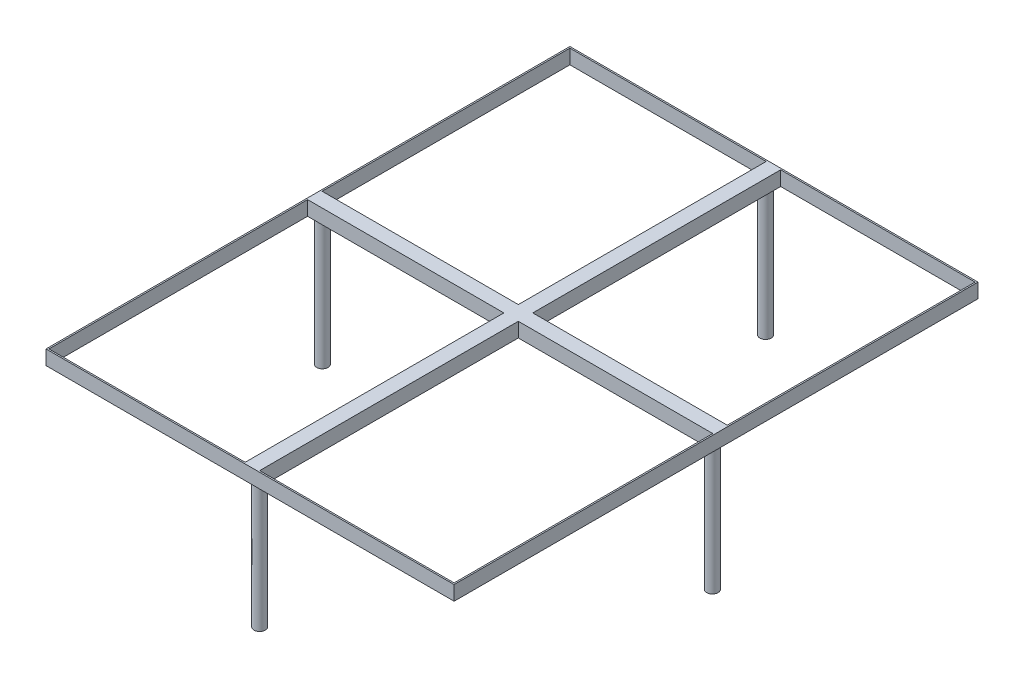
ISO-10303-21;
HEADER;
FILE_DESCRIPTION(('STEP AP214'),'2;1');
FILE_NAME('part.step','',(''),(''),'','','');
FILE_SCHEMA(('AUTOMOTIVE_DESIGN { 1 0 10303 214 1 1 1 1 }'));
ENDSEC;
DATA;
#1=APPLICATION_CONTEXT('core data for automotive mechanical design processes');
#2=APPLICATION_PROTOCOL_DEFINITION('international standard','automotive_design',2000,#1);
#3=PRODUCT_CONTEXT('',#1,'mechanical');
#4=PRODUCT('Part','Part','',(#3));
#5=PRODUCT_RELATED_PRODUCT_CATEGORY('part','',(#4));
#6=PRODUCT_DEFINITION_FORMATION('','',#4);
#7=PRODUCT_DEFINITION_CONTEXT('part definition',#1,'design');
#8=PRODUCT_DEFINITION('design','',#6,#7);
#9=PRODUCT_DEFINITION_SHAPE('','',#8);
#10=(LENGTH_UNIT() NAMED_UNIT(*) SI_UNIT(.MILLI.,.METRE.));
#11=(NAMED_UNIT(*) PLANE_ANGLE_UNIT() SI_UNIT($,.RADIAN.));
#12=(NAMED_UNIT(*) SI_UNIT($,.STERADIAN.) SOLID_ANGLE_UNIT());
#13=UNCERTAINTY_MEASURE_WITH_UNIT(LENGTH_MEASURE(1.E-05),#10,'distance_accuracy_value','');
#14=(GEOMETRIC_REPRESENTATION_CONTEXT(3) GLOBAL_UNCERTAINTY_ASSIGNED_CONTEXT((#13)) GLOBAL_UNIT_ASSIGNED_CONTEXT((#10,
#11,#12)) REPRESENTATION_CONTEXT('',''));
#15=CARTESIAN_POINT('',(0.,0.,0.));
#16=DIRECTION('',(0.,0.,1.));
#17=DIRECTION('',(1.,0.,0.));
#18=AXIS2_PLACEMENT_3D('',#15,#16,#17);
#19=CARTESIAN_POINT('',(-269.333333333334,20.,-269.333333333332));
#20=DIRECTION('',(1.,0.,0.));
#21=DIRECTION('',(0.,0.,-1.));
#22=AXIS2_PLACEMENT_3D('',#19,#20,#21);
#23=PLANE('',#22);
#24=DIRECTION('',(0.,0.,1.));
#25=VECTOR('',#24,1.);
#26=CARTESIAN_POINT('',(-269.333333333334,20.,-269.333333333332));
#27=LINE('',#26,#25);
#28=CARTESIAN_POINT('',(-269.333333333334,20.,-269.333333333332));
#29=VERTEX_POINT('',#28);
#30=CARTESIAN_POINT('',(-269.333333333334,20.,73.199168447962));
#31=VERTEX_POINT('',#30);
#32=EDGE_CURVE('E56',#29,#31,#27,.T.);
#33=ORIENTED_EDGE('',*,*,#32,.T.);
#34=DIRECTION('',(0.,1.,0.));
#35=VECTOR('',#34,1.);
#36=CARTESIAN_POINT('',(-269.333333333334,0.,73.1991684479621));
#37=LINE('',#36,#35);
#38=CARTESIAN_POINT('',(-269.333333333334,0.,73.199168447962));
#39=VERTEX_POINT('',#38);
#40=EDGE_CURVE('E254',#39,#31,#37,.T.);
#41=ORIENTED_EDGE('',*,*,#40,.F.);
#42=DIRECTION('',(0.,0.,1.));
#43=VECTOR('',#42,1.);
#44=CARTESIAN_POINT('',(-269.333333333334,0.,-269.333333333332));
#45=LINE('',#44,#43);
#46=CARTESIAN_POINT('',(-269.333333333334,0.,-269.333333333332));
#47=VERTEX_POINT('',#46);
#48=EDGE_CURVE('E283',#47,#39,#45,.T.);
#49=ORIENTED_EDGE('',*,*,#48,.F.);
#50=DIRECTION('',(0.,-1.,0.));
#51=VECTOR('',#50,1.);
#52=CARTESIAN_POINT('',(-269.333333333334,20.,-269.333333333332));
#53=LINE('',#52,#51);
#54=EDGE_CURVE('E282',#29,#47,#53,.T.);
#55=ORIENTED_EDGE('',*,*,#54,.F.);
#56=EDGE_LOOP('',(#33,#41,#49,#55));
#57=FACE_BOUND('',#56,.T.);
#58=ADVANCED_FACE('F41',(#57),#23,.T.);
#59=CARTESIAN_POINT('',(-269.333333333334,20.,450.666666666668));
#60=DIRECTION('',(0.,0.,-1.));
#61=DIRECTION('',(-1.,0.,0.));
#62=AXIS2_PLACEMENT_3D('',#59,#60,#61);
#63=PLANE('',#62);
#64=DIRECTION('',(1.,0.,0.));
#65=VECTOR('',#64,1.);
#66=CARTESIAN_POINT('',(-269.333333333334,0.,450.666666666668));
#67=LINE('',#66,#65);
#68=CARTESIAN_POINT('',(21.9402136821437,0.,450.666666666668));
#69=VERTEX_POINT('',#68);
#70=CARTESIAN_POINT('',(290.666666666666,0.,450.666666666668));
#71=VERTEX_POINT('',#70);
#72=EDGE_CURVE('E286',#69,#71,#67,.T.);
#73=ORIENTED_EDGE('',*,*,#72,.F.);
#74=DIRECTION('',(0.,1.,0.));
#75=VECTOR('',#74,1.);
#76=CARTESIAN_POINT('',(21.9402136821438,0.,450.666666666668));
#77=LINE('',#76,#75);
#78=CARTESIAN_POINT('',(21.9402136821438,20.,450.666666666668));
#79=VERTEX_POINT('',#78);
#80=EDGE_CURVE('E199',#69,#79,#77,.T.);
#81=ORIENTED_EDGE('',*,*,#80,.T.);
#82=DIRECTION('',(1.,0.,0.));
#83=VECTOR('',#82,1.);
#84=CARTESIAN_POINT('',(-269.333333333334,20.,450.666666666668));
#85=LINE('',#84,#83);
#86=CARTESIAN_POINT('',(290.666666666666,20.,450.666666666668));
#87=VERTEX_POINT('',#86);
#88=EDGE_CURVE('E272',#79,#87,#85,.T.);
#89=ORIENTED_EDGE('',*,*,#88,.T.);
#90=DIRECTION('',(0.,-1.,0.));
#91=VECTOR('',#90,1.);
#92=CARTESIAN_POINT('',(290.666666666666,20.,450.666666666668));
#93=LINE('',#92,#91);
#94=EDGE_CURVE('E301',#87,#71,#93,.T.);
#95=ORIENTED_EDGE('',*,*,#94,.T.);
#96=EDGE_LOOP('',(#73,#81,#89,#95));
#97=FACE_BOUND('',#96,.T.);
#98=ADVANCED_FACE('F406',(#97),#63,.T.);
#99=CARTESIAN_POINT('',(290.666666666666,20.,-269.333333333332));
#100=DIRECTION('',(-1.,0.,0.));
#101=DIRECTION('',(0.,0.,1.));
#102=AXIS2_PLACEMENT_3D('',#99,#100,#101);
#103=PLANE('',#102);
#104=DIRECTION('',(0.,0.,-1.));
#105=VECTOR('',#104,1.);
#106=CARTESIAN_POINT('',(290.666666666666,0.,-269.333333333332));
#107=LINE('',#106,#105);
#108=CARTESIAN_POINT('',(290.666666666666,0.,73.199168447962));
#109=VERTEX_POINT('',#108);
#110=CARTESIAN_POINT('',(290.666666666666,0.,-269.333333333332));
#111=VERTEX_POINT('',#110);
#112=EDGE_CURVE('E290',#109,#111,#107,.T.);
#113=ORIENTED_EDGE('',*,*,#112,.F.);
#114=DIRECTION('',(0.,1.,0.));
#115=VECTOR('',#114,1.);
#116=CARTESIAN_POINT('',(290.666666666666,0.,73.1991684479621));
#117=LINE('',#116,#115);
#118=CARTESIAN_POINT('',(290.666666666666,20.,73.1991684479621));
#119=VERTEX_POINT('',#118);
#120=EDGE_CURVE('E267',#109,#119,#117,.T.);
#121=ORIENTED_EDGE('',*,*,#120,.T.);
#122=DIRECTION('',(0.,0.,-1.));
#123=VECTOR('',#122,1.);
#124=CARTESIAN_POINT('',(290.666666666666,20.,-269.333333333332));
#125=LINE('',#124,#123);
#126=CARTESIAN_POINT('',(290.666666666666,20.,-269.333333333332));
#127=VERTEX_POINT('',#126);
#128=EDGE_CURVE('E276',#119,#127,#125,.T.);
#129=ORIENTED_EDGE('',*,*,#128,.T.);
#130=DIRECTION('',(0.,-1.,0.));
#131=VECTOR('',#130,1.);
#132=CARTESIAN_POINT('',(290.666666666666,20.,-269.333333333332));
#133=LINE('',#132,#131);
#134=EDGE_CURVE('E298',#127,#111,#133,.T.);
#135=ORIENTED_EDGE('',*,*,#134,.T.);
#136=EDGE_LOOP('',(#113,#121,#129,#135));
#137=FACE_BOUND('',#136,.T.);
#138=ADVANCED_FACE('F389',(#137),#103,.T.);
#139=CARTESIAN_POINT('',(-269.333333333334,20.,-269.333333333332));
#140=DIRECTION('',(0.,0.,1.));
#141=DIRECTION('',(1.,0.,0.));
#142=AXIS2_PLACEMENT_3D('',#139,#140,#141);
#143=PLANE('',#142);
#144=DIRECTION('',(-1.,0.,0.));
#145=VECTOR('',#144,1.);
#146=CARTESIAN_POINT('',(-269.333333333334,20.,-269.333333333332));
#147=LINE('',#146,#145);
#148=CARTESIAN_POINT('',(21.9402136821437,20.,-269.333333333332));
#149=VERTEX_POINT('',#148);
#150=EDGE_CURVE('E280',#127,#149,#147,.T.);
#151=ORIENTED_EDGE('',*,*,#150,.T.);
#152=DIRECTION('',(0.,1.,0.));
#153=VECTOR('',#152,1.);
#154=CARTESIAN_POINT('',(21.9402136821437,0.,-269.333333333332));
#155=LINE('',#154,#153);
#156=CARTESIAN_POINT('',(21.9402136821437,0.,-269.333333333332));
#157=VERTEX_POINT('',#156);
#158=EDGE_CURVE('E261',#157,#149,#155,.T.);
#159=ORIENTED_EDGE('',*,*,#158,.F.);
#160=DIRECTION('',(-1.,0.,0.));
#161=VECTOR('',#160,1.);
#162=CARTESIAN_POINT('',(-269.333333333334,0.,-269.333333333332));
#163=LINE('',#162,#161);
#164=EDGE_CURVE('E293',#111,#157,#163,.T.);
#165=ORIENTED_EDGE('',*,*,#164,.F.);
#166=ORIENTED_EDGE('',*,*,#134,.F.);
#167=EDGE_LOOP('',(#151,#159,#165,#166));
#168=FACE_BOUND('',#167,.T.);
#169=ADVANCED_FACE('F375',(#168),#143,.T.);
#170=CARTESIAN_POINT('',(0.,20.,0.));
#171=DIRECTION('',(0.,1.,0.));
#172=DIRECTION('',(0.,0.,1.));
#173=AXIS2_PLACEMENT_3D('',#170,#171,#172);
#174=PLANE('',#173);
#175=DIRECTION('',(1.,0.,0.));
#176=VECTOR('',#175,1.);
#177=CARTESIAN_POINT('',(0.,20.,73.1991684479621));
#178=LINE('',#177,#176);
#179=CARTESIAN_POINT('',(1.94021368214367,20.,73.1991684479621));
#180=VERTEX_POINT('',#179);
#181=EDGE_CURVE('E238',#31,#180,#178,.T.);
#182=ORIENTED_EDGE('',*,*,#181,.F.);
#183=ORIENTED_EDGE('',*,*,#32,.F.);
#184=CARTESIAN_POINT('',(1.94021368214364,20.,-269.333333333332));
#185=VERTEX_POINT('',#184);
#186=EDGE_CURVE('E279',#185,#29,#147,.T.);
#187=ORIENTED_EDGE('',*,*,#186,.F.);
#188=DIRECTION('',(0.,0.,1.));
#189=VECTOR('',#188,1.);
#190=CARTESIAN_POINT('',(1.94021368214369,20.,0.));
#191=LINE('',#190,#189);
#192=EDGE_CURVE('E235',#185,#180,#191,.T.);
#193=ORIENTED_EDGE('',*,*,#192,.T.);
#194=EDGE_LOOP('',(#182,#183,#187,#193));
#195=FACE_BOUND('',#194,.T.);
#196=DIRECTION('',(0.,0.,1.));
#197=VECTOR('',#196,1.);
#198=CARTESIAN_POINT('',(1.94021368214369,20.,0.));
#199=LINE('',#198,#197);
#200=CARTESIAN_POINT('',(1.94021368214373,20.,93.1991684479621));
#201=VERTEX_POINT('',#200);
#202=CARTESIAN_POINT('',(1.94021368214375,20.,450.666666666668));
#203=VERTEX_POINT('',#202);
#204=EDGE_CURVE('E201',#201,#203,#199,.T.);
#205=ORIENTED_EDGE('',*,*,#204,.T.);
#206=CARTESIAN_POINT('',(-269.333333333334,20.,450.666666666668));
#207=VERTEX_POINT('',#206);
#208=EDGE_CURVE('E274',#207,#203,#85,.T.);
#209=ORIENTED_EDGE('',*,*,#208,.F.);
#210=CARTESIAN_POINT('',(-269.333333333334,20.,93.1991684479621));
#211=VERTEX_POINT('',#210);
#212=EDGE_CURVE('E273',#211,#207,#27,.T.);
#213=ORIENTED_EDGE('',*,*,#212,.F.);
#214=DIRECTION('',(1.,0.,0.));
#215=VECTOR('',#214,1.);
#216=CARTESIAN_POINT('',(0.,20.,93.1991684479621));
#217=LINE('',#216,#215);
#218=EDGE_CURVE('E241',#211,#201,#217,.T.);
#219=ORIENTED_EDGE('',*,*,#218,.T.);
#220=EDGE_LOOP('',(#205,#209,#213,#219));
#221=FACE_BOUND('',#220,.T.);
#222=DIRECTION('',(1.,0.,0.));
#223=VECTOR('',#222,1.);
#224=CARTESIAN_POINT('',(0.,20.,93.1991684479621));
#225=LINE('',#224,#223);
#226=CARTESIAN_POINT('',(21.9402136821437,20.,93.1991684479621));
#227=VERTEX_POINT('',#226);
#228=CARTESIAN_POINT('',(290.666666666666,20.,93.199168447962));
#229=VERTEX_POINT('',#228);
#230=EDGE_CURVE('E187',#227,#229,#225,.T.);
#231=ORIENTED_EDGE('',*,*,#230,.T.);
#232=EDGE_CURVE('E277',#87,#229,#125,.T.);
#233=ORIENTED_EDGE('',*,*,#232,.F.);
#234=ORIENTED_EDGE('',*,*,#88,.F.);
#235=DIRECTION('',(0.,0.,1.));
#236=VECTOR('',#235,1.);
#237=CARTESIAN_POINT('',(21.9402136821437,20.,0.));
#238=LINE('',#237,#236);
#239=EDGE_CURVE('E226',#227,#79,#238,.T.);
#240=ORIENTED_EDGE('',*,*,#239,.F.);
#241=EDGE_LOOP('',(#231,#233,#234,#240));
#242=FACE_BOUND('',#241,.T.);
#243=DIRECTION('',(0.,0.,1.));
#244=VECTOR('',#243,1.);
#245=CARTESIAN_POINT('',(-271.333333333334,20.,-271.333333333332));
#246=LINE('',#245,#244);
#247=CARTESIAN_POINT('',(-271.333333333334,20.,-271.333333333332));
#248=VERTEX_POINT('',#247);
#249=CARTESIAN_POINT('',(-271.333333333334,20.,452.666666666668));
#250=VERTEX_POINT('',#249);
#251=EDGE_CURVE('E307',#248,#250,#246,.T.);
#252=ORIENTED_EDGE('',*,*,#251,.T.);
#253=DIRECTION('',(1.,0.,0.));
#254=VECTOR('',#253,1.);
#255=CARTESIAN_POINT('',(-271.333333333334,20.,452.666666666668));
#256=LINE('',#255,#254);
#257=CARTESIAN_POINT('',(292.666666666666,20.,452.666666666668));
#258=VERTEX_POINT('',#257);
#259=EDGE_CURVE('E310',#250,#258,#256,.T.);
#260=ORIENTED_EDGE('',*,*,#259,.T.);
#261=DIRECTION('',(0.,0.,-1.));
#262=VECTOR('',#261,1.);
#263=CARTESIAN_POINT('',(292.666666666666,20.,-271.333333333332));
#264=LINE('',#263,#262);
#265=CARTESIAN_POINT('',(292.666666666666,20.,-271.333333333332));
#266=VERTEX_POINT('',#265);
#267=EDGE_CURVE('E313',#258,#266,#264,.T.);
#268=ORIENTED_EDGE('',*,*,#267,.T.);
#269=DIRECTION('',(-1.,0.,0.));
#270=VECTOR('',#269,1.);
#271=CARTESIAN_POINT('',(-271.333333333334,20.,-271.333333333332));
#272=LINE('',#271,#270);
#273=EDGE_CURVE('E315',#266,#248,#272,.T.);
#274=ORIENTED_EDGE('',*,*,#273,.T.);
#275=EDGE_LOOP('',(#252,#260,#268,#274));
#276=FACE_BOUND('',#275,.T.);
#277=ORIENTED_EDGE('',*,*,#128,.F.);
#278=DIRECTION('',(1.,0.,0.));
#279=VECTOR('',#278,1.);
#280=CARTESIAN_POINT('',(0.,20.,73.1991684479621));
#281=LINE('',#280,#279);
#282=CARTESIAN_POINT('',(21.9402136821437,20.,73.1991684479621));
#283=VERTEX_POINT('',#282);
#284=EDGE_CURVE('E230',#283,#119,#281,.T.);
#285=ORIENTED_EDGE('',*,*,#284,.F.);
#286=DIRECTION('',(0.,0.,1.));
#287=VECTOR('',#286,1.);
#288=CARTESIAN_POINT('',(21.9402136821437,20.,0.));
#289=LINE('',#288,#287);
#290=EDGE_CURVE('E233',#149,#283,#289,.T.);
#291=ORIENTED_EDGE('',*,*,#290,.F.);
#292=ORIENTED_EDGE('',*,*,#150,.F.);
#293=EDGE_LOOP('',(#277,#285,#291,#292));
#294=FACE_BOUND('',#293,.T.);
#295=ADVANCED_FACE('F348',(#195,#221,#242,#276,#294),#174,.T.);
#296=CARTESIAN_POINT('',(0.,0.,0.));
#297=DIRECTION('',(0.,1.,0.));
#298=DIRECTION('',(0.,0.,1.));
#299=AXIS2_PLACEMENT_3D('',#296,#297,#298);
#300=PLANE('',#299);
#301=CARTESIAN_POINT('',(-258.982651015203,0.,83.0174274599046));
#302=DIRECTION('',(0.,1.,0.));
#303=DIRECTION('',(0.,0.,1.));
#304=AXIS2_PLACEMENT_3D('',#301,#302,#303);
#305=CIRCLE('',#304,7.80799506400789);
#306=CARTESIAN_POINT('',(-258.982651015203,0.,90.8254225239125));
#307=VERTEX_POINT('',#306);
#308=EDGE_CURVE('E11',#307,#307,#305,.F.);
#309=ORIENTED_EDGE('',*,*,#308,.F.);
#310=EDGE_LOOP('',(#309));
#311=FACE_BOUND('',#310,.T.);
#312=CARTESIAN_POINT('',(12.045659380478,0.,-258.363567648438));
#313=DIRECTION('',(0.,1.,0.));
#314=DIRECTION('',(0.,0.,1.));
#315=AXIS2_PLACEMENT_3D('',#312,#313,#314);
#316=CIRCLE('',#315,7.8079950640079);
#317=CARTESIAN_POINT('',(12.045659380478,0.,-250.55557258443));
#318=VERTEX_POINT('',#317);
#319=EDGE_CURVE('E49',#318,#318,#316,.F.);
#320=ORIENTED_EDGE('',*,*,#319,.F.);
#321=EDGE_LOOP('',(#320));
#322=FACE_BOUND('',#321,.T.);
#323=CARTESIAN_POINT('',(12.045659380478,0.,440.740646454213));
#324=DIRECTION('',(0.,1.,0.));
#325=DIRECTION('',(0.,0.,1.));
#326=AXIS2_PLACEMENT_3D('',#323,#324,#325);
#327=CIRCLE('',#326,7.8079950640079);
#328=CARTESIAN_POINT('',(12.045659380478,0.,448.548641518221));
#329=VERTEX_POINT('',#328);
#330=EDGE_CURVE('E339',#329,#329,#327,.F.);
#331=ORIENTED_EDGE('',*,*,#330,.F.);
#332=EDGE_LOOP('',(#331));
#333=FACE_BOUND('',#332,.T.);
#334=CARTESIAN_POINT('',(279.956227740303,0.,83.0174274599046));
#335=DIRECTION('',(0.,1.,0.));
#336=DIRECTION('',(0.,0.,1.));
#337=AXIS2_PLACEMENT_3D('',#334,#335,#336);
#338=CIRCLE('',#337,7.80799506400789);
#339=CARTESIAN_POINT('',(279.956227740303,0.,90.8254225239125));
#340=VERTEX_POINT('',#339);
#341=EDGE_CURVE('E336',#340,#340,#338,.F.);
#342=ORIENTED_EDGE('',*,*,#341,.F.);
#343=EDGE_LOOP('',(#342));
#344=FACE_BOUND('',#343,.T.);
#345=ORIENTED_EDGE('',*,*,#48,.T.);
#346=DIRECTION('',(1.,0.,0.));
#347=VECTOR('',#346,1.);
#348=CARTESIAN_POINT('',(0.,0.,73.1991684479621));
#349=LINE('',#348,#347);
#350=CARTESIAN_POINT('',(1.94021368214367,0.,73.1991684479621));
#351=VERTEX_POINT('',#350);
#352=EDGE_CURVE('E219',#39,#351,#349,.T.);
#353=ORIENTED_EDGE('',*,*,#352,.T.);
#354=DIRECTION('',(0.,0.,1.));
#355=VECTOR('',#354,1.);
#356=CARTESIAN_POINT('',(1.94021368214369,0.,0.));
#357=LINE('',#356,#355);
#358=CARTESIAN_POINT('',(1.94021368214364,0.,-269.333333333332));
#359=VERTEX_POINT('',#358);
#360=EDGE_CURVE('E216',#359,#351,#357,.T.);
#361=ORIENTED_EDGE('',*,*,#360,.F.);
#362=EDGE_CURVE('E292',#359,#47,#163,.T.);
#363=ORIENTED_EDGE('',*,*,#362,.T.);
#364=EDGE_LOOP('',(#345,#353,#361,#363));
#365=FACE_BOUND('',#364,.T.);
#366=CARTESIAN_POINT('',(-269.333333333334,0.,450.666666666668));
#367=VERTEX_POINT('',#366);
#368=CARTESIAN_POINT('',(1.94021368214375,0.,450.666666666668));
#369=VERTEX_POINT('',#368);
#370=EDGE_CURVE('E287',#367,#369,#67,.T.);
#371=ORIENTED_EDGE('',*,*,#370,.T.);
#372=DIRECTION('',(0.,0.,1.));
#373=VECTOR('',#372,1.);
#374=CARTESIAN_POINT('',(1.94021368214369,0.,0.));
#375=LINE('',#374,#373);
#376=CARTESIAN_POINT('',(1.94021368214373,0.,93.1991684479621));
#377=VERTEX_POINT('',#376);
#378=EDGE_CURVE('E192',#377,#369,#375,.T.);
#379=ORIENTED_EDGE('',*,*,#378,.F.);
#380=DIRECTION('',(1.,0.,0.));
#381=VECTOR('',#380,1.);
#382=CARTESIAN_POINT('',(0.,0.,93.1991684479621));
#383=LINE('',#382,#381);
#384=CARTESIAN_POINT('',(-269.333333333334,0.,93.199168447962));
#385=VERTEX_POINT('',#384);
#386=EDGE_CURVE('E221',#385,#377,#383,.T.);
#387=ORIENTED_EDGE('',*,*,#386,.F.);
#388=EDGE_CURVE('E64',#385,#367,#45,.T.);
#389=ORIENTED_EDGE('',*,*,#388,.T.);
#390=EDGE_LOOP('',(#371,#379,#387,#389));
#391=FACE_BOUND('',#390,.T.);
#392=CARTESIAN_POINT('',(290.666666666666,0.,93.199168447962));
#393=VERTEX_POINT('',#392);
#394=EDGE_CURVE('E207',#71,#393,#107,.T.);
#395=ORIENTED_EDGE('',*,*,#394,.T.);
#396=DIRECTION('',(1.,0.,0.));
#397=VECTOR('',#396,1.);
#398=CARTESIAN_POINT('',(0.,0.,93.1991684479621));
#399=LINE('',#398,#397);
#400=CARTESIAN_POINT('',(21.9402136821437,0.,93.1991684479621));
#401=VERTEX_POINT('',#400);
#402=EDGE_CURVE('E185',#401,#393,#399,.T.);
#403=ORIENTED_EDGE('',*,*,#402,.F.);
#404=DIRECTION('',(0.,0.,1.));
#405=VECTOR('',#404,1.);
#406=CARTESIAN_POINT('',(21.9402136821437,0.,0.));
#407=LINE('',#406,#405);
#408=EDGE_CURVE('E196',#401,#69,#407,.T.);
#409=ORIENTED_EDGE('',*,*,#408,.T.);
#410=ORIENTED_EDGE('',*,*,#72,.T.);
#411=EDGE_LOOP('',(#395,#403,#409,#410));
#412=FACE_BOUND('',#411,.T.);
#413=DIRECTION('',(0.,0.,1.));
#414=VECTOR('',#413,1.);
#415=CARTESIAN_POINT('',(-271.333333333334,0.,-271.333333333332));
#416=LINE('',#415,#414);
#417=CARTESIAN_POINT('',(-271.333333333334,0.,-271.333333333332));
#418=VERTEX_POINT('',#417);
#419=CARTESIAN_POINT('',(-271.333333333334,0.,452.666666666668));
#420=VERTEX_POINT('',#419);
#421=EDGE_CURVE('E306',#418,#420,#416,.T.);
#422=ORIENTED_EDGE('',*,*,#421,.F.);
#423=DIRECTION('',(-1.,0.,0.));
#424=VECTOR('',#423,1.);
#425=CARTESIAN_POINT('',(-271.333333333334,0.,-271.333333333332));
#426=LINE('',#425,#424);
#427=CARTESIAN_POINT('',(292.666666666666,0.,-271.333333333332));
#428=VERTEX_POINT('',#427);
#429=EDGE_CURVE('E311',#428,#418,#426,.T.);
#430=ORIENTED_EDGE('',*,*,#429,.F.);
#431=DIRECTION('',(0.,0.,-1.));
#432=VECTOR('',#431,1.);
#433=CARTESIAN_POINT('',(292.666666666666,0.,-271.333333333332));
#434=LINE('',#433,#432);
#435=CARTESIAN_POINT('',(292.666666666666,0.,452.666666666668));
#436=VERTEX_POINT('',#435);
#437=EDGE_CURVE('E322',#436,#428,#434,.T.);
#438=ORIENTED_EDGE('',*,*,#437,.F.);
#439=DIRECTION('',(1.,0.,0.));
#440=VECTOR('',#439,1.);
#441=CARTESIAN_POINT('',(-271.333333333334,0.,452.666666666668));
#442=LINE('',#441,#440);
#443=EDGE_CURVE('E320',#420,#436,#442,.T.);
#444=ORIENTED_EDGE('',*,*,#443,.F.);
#445=EDGE_LOOP('',(#422,#430,#438,#444));
#446=FACE_BOUND('',#445,.T.);
#447=DIRECTION('',(1.,0.,0.));
#448=VECTOR('',#447,1.);
#449=CARTESIAN_POINT('',(0.,0.,73.1991684479621));
#450=LINE('',#449,#448);
#451=CARTESIAN_POINT('',(21.9402136821437,0.,73.1991684479621));
#452=VERTEX_POINT('',#451);
#453=EDGE_CURVE('E208',#452,#109,#450,.T.);
#454=ORIENTED_EDGE('',*,*,#453,.T.);
#455=ORIENTED_EDGE('',*,*,#112,.T.);
#456=ORIENTED_EDGE('',*,*,#164,.T.);
#457=DIRECTION('',(0.,0.,1.));
#458=VECTOR('',#457,1.);
#459=CARTESIAN_POINT('',(21.9402136821437,0.,0.));
#460=LINE('',#459,#458);
#461=EDGE_CURVE('E211',#157,#452,#460,.T.);
#462=ORIENTED_EDGE('',*,*,#461,.T.);
#463=EDGE_LOOP('',(#454,#455,#456,#462));
#464=FACE_BOUND('',#463,.T.);
#465=ADVANCED_FACE('F204',(#311,#322,#333,#344,#365,#391,#412,#446,#464),#300,.F.);
#466=CARTESIAN_POINT('',(-271.333333333334,20.,-271.333333333332));
#467=DIRECTION('',(1.,0.,0.));
#468=DIRECTION('',(0.,0.,-1.));
#469=AXIS2_PLACEMENT_3D('',#466,#467,#468);
#470=PLANE('',#469);
#471=ORIENTED_EDGE('',*,*,#421,.T.);
#472=DIRECTION('',(0.,-1.,0.));
#473=VECTOR('',#472,1.);
#474=CARTESIAN_POINT('',(-271.333333333334,20.,452.666666666668));
#475=LINE('',#474,#473);
#476=EDGE_CURVE('E333',#250,#420,#475,.T.);
#477=ORIENTED_EDGE('',*,*,#476,.F.);
#478=ORIENTED_EDGE('',*,*,#251,.F.);
#479=DIRECTION('',(0.,-1.,0.));
#480=VECTOR('',#479,1.);
#481=CARTESIAN_POINT('',(-271.333333333334,20.,-271.333333333332));
#482=LINE('',#481,#480);
#483=EDGE_CURVE('E317',#248,#418,#482,.T.);
#484=ORIENTED_EDGE('',*,*,#483,.T.);
#485=EDGE_LOOP('',(#471,#477,#478,#484));
#486=FACE_BOUND('',#485,.T.);
#487=ADVANCED_FACE('F43',(#486),#470,.F.);
#488=CARTESIAN_POINT('',(-271.333333333334,20.,452.666666666668));
#489=DIRECTION('',(0.,0.,-1.));
#490=DIRECTION('',(-1.,0.,0.));
#491=AXIS2_PLACEMENT_3D('',#488,#489,#490);
#492=PLANE('',#491);
#493=ORIENTED_EDGE('',*,*,#443,.T.);
#494=DIRECTION('',(0.,-1.,0.));
#495=VECTOR('',#494,1.);
#496=CARTESIAN_POINT('',(292.666666666666,20.,452.666666666668));
#497=LINE('',#496,#495);
#498=EDGE_CURVE('E330',#258,#436,#497,.T.);
#499=ORIENTED_EDGE('',*,*,#498,.F.);
#500=ORIENTED_EDGE('',*,*,#259,.F.);
#501=ORIENTED_EDGE('',*,*,#476,.T.);
#502=EDGE_LOOP('',(#493,#499,#500,#501));
#503=FACE_BOUND('',#502,.T.);
#504=ADVANCED_FACE('F431',(#503),#492,.F.);
#505=CARTESIAN_POINT('',(292.666666666666,20.,-271.333333333332));
#506=DIRECTION('',(-1.,0.,0.));
#507=DIRECTION('',(0.,0.,1.));
#508=AXIS2_PLACEMENT_3D('',#505,#506,#507);
#509=PLANE('',#508);
#510=ORIENTED_EDGE('',*,*,#437,.T.);
#511=DIRECTION('',(0.,-1.,0.));
#512=VECTOR('',#511,1.);
#513=CARTESIAN_POINT('',(292.666666666666,20.,-271.333333333332));
#514=LINE('',#513,#512);
#515=EDGE_CURVE('E327',#266,#428,#514,.T.);
#516=ORIENTED_EDGE('',*,*,#515,.F.);
#517=ORIENTED_EDGE('',*,*,#267,.F.);
#518=ORIENTED_EDGE('',*,*,#498,.T.);
#519=EDGE_LOOP('',(#510,#516,#517,#518));
#520=FACE_BOUND('',#519,.T.);
#521=ADVANCED_FACE('F425',(#520),#509,.F.);
#522=CARTESIAN_POINT('',(-271.333333333334,20.,-271.333333333332));
#523=DIRECTION('',(0.,0.,1.));
#524=DIRECTION('',(1.,0.,0.));
#525=AXIS2_PLACEMENT_3D('',#522,#523,#524);
#526=PLANE('',#525);
#527=ORIENTED_EDGE('',*,*,#429,.T.);
#528=ORIENTED_EDGE('',*,*,#483,.F.);
#529=ORIENTED_EDGE('',*,*,#273,.F.);
#530=ORIENTED_EDGE('',*,*,#515,.T.);
#531=EDGE_LOOP('',(#527,#528,#529,#530));
#532=FACE_BOUND('',#531,.T.);
#533=ADVANCED_FACE('F421',(#532),#526,.F.);
#534=DIRECTION('',(0.,1.,0.));
#535=VECTOR('',#534,1.);
#536=CARTESIAN_POINT('',(-269.333333333334,0.,93.1991684479621));
#537=LINE('',#536,#535);
#538=EDGE_CURVE('E252',#385,#211,#537,.T.);
#539=ORIENTED_EDGE('',*,*,#538,.T.);
#540=ORIENTED_EDGE('',*,*,#212,.T.);
#541=DIRECTION('',(0.,-1.,0.));
#542=VECTOR('',#541,1.);
#543=CARTESIAN_POINT('',(-269.333333333334,20.,450.666666666668));
#544=LINE('',#543,#542);
#545=EDGE_CURVE('E304',#207,#367,#544,.T.);
#546=ORIENTED_EDGE('',*,*,#545,.T.);
#547=ORIENTED_EDGE('',*,*,#388,.F.);
#548=EDGE_LOOP('',(#539,#540,#546,#547));
#549=FACE_BOUND('',#548,.T.);
#550=ADVANCED_FACE('F369',(#549),#23,.T.);
#551=DIRECTION('',(0.,1.,0.));
#552=VECTOR('',#551,1.);
#553=CARTESIAN_POINT('',(1.94021368214373,0.,450.666666666668));
#554=LINE('',#553,#552);
#555=EDGE_CURVE('E247',#369,#203,#554,.T.);
#556=ORIENTED_EDGE('',*,*,#555,.F.);
#557=ORIENTED_EDGE('',*,*,#370,.F.);
#558=ORIENTED_EDGE('',*,*,#545,.F.);
#559=ORIENTED_EDGE('',*,*,#208,.T.);
#560=EDGE_LOOP('',(#556,#557,#558,#559));
#561=FACE_BOUND('',#560,.T.);
#562=ADVANCED_FACE('F372',(#561),#63,.T.);
#563=DIRECTION('',(0.,1.,0.));
#564=VECTOR('',#563,1.);
#565=CARTESIAN_POINT('',(290.666666666666,0.,93.1991684479621));
#566=LINE('',#565,#564);
#567=EDGE_CURVE('E191',#393,#229,#566,.T.);
#568=ORIENTED_EDGE('',*,*,#567,.F.);
#569=ORIENTED_EDGE('',*,*,#394,.F.);
#570=ORIENTED_EDGE('',*,*,#94,.F.);
#571=ORIENTED_EDGE('',*,*,#232,.T.);
#572=EDGE_LOOP('',(#568,#569,#570,#571));
#573=FACE_BOUND('',#572,.T.);
#574=ADVANCED_FACE('F408',(#573),#103,.T.);
#575=DIRECTION('',(0.,1.,0.));
#576=VECTOR('',#575,1.);
#577=CARTESIAN_POINT('',(1.94021368214364,0.,-269.333333333332));
#578=LINE('',#577,#576);
#579=EDGE_CURVE('E258',#359,#185,#578,.T.);
#580=ORIENTED_EDGE('',*,*,#579,.T.);
#581=ORIENTED_EDGE('',*,*,#186,.T.);
#582=ORIENTED_EDGE('',*,*,#54,.T.);
#583=ORIENTED_EDGE('',*,*,#362,.F.);
#584=EDGE_LOOP('',(#580,#581,#582,#583));
#585=FACE_BOUND('',#584,.T.);
#586=ADVANCED_FACE('F402',(#585),#143,.T.);
#587=CARTESIAN_POINT('',(21.9402136821437,0.,0.));
#588=DIRECTION('',(-1.,0.,0.));
#589=DIRECTION('',(0.,0.,1.));
#590=AXIS2_PLACEMENT_3D('',#587,#588,#589);
#591=PLANE('',#590);
#592=ORIENTED_EDGE('',*,*,#239,.T.);
#593=ORIENTED_EDGE('',*,*,#80,.F.);
#594=ORIENTED_EDGE('',*,*,#408,.F.);
#595=DIRECTION('',(0.,1.,0.));
#596=VECTOR('',#595,1.);
#597=CARTESIAN_POINT('',(21.9402136821437,0.,93.1991684479621));
#598=LINE('',#597,#596);
#599=EDGE_CURVE('E180',#401,#227,#598,.T.);
#600=ORIENTED_EDGE('',*,*,#599,.T.);
#601=EDGE_LOOP('',(#592,#593,#594,#600));
#602=FACE_BOUND('',#601,.T.);
#603=ADVANCED_FACE('F197',(#602),#591,.F.);
#604=CARTESIAN_POINT('',(1.94021368214369,0.,0.));
#605=DIRECTION('',(-1.,0.,0.));
#606=DIRECTION('',(0.,0.,1.));
#607=AXIS2_PLACEMENT_3D('',#604,#605,#606);
#608=PLANE('',#607);
#609=ORIENTED_EDGE('',*,*,#204,.F.);
#610=DIRECTION('',(0.,1.,0.));
#611=VECTOR('',#610,1.);
#612=CARTESIAN_POINT('',(1.94021368214373,0.,93.1991684479621));
#613=LINE('',#612,#611);
#614=EDGE_CURVE('E250',#377,#201,#613,.T.);
#615=ORIENTED_EDGE('',*,*,#614,.F.);
#616=ORIENTED_EDGE('',*,*,#378,.T.);
#617=ORIENTED_EDGE('',*,*,#555,.T.);
#618=EDGE_LOOP('',(#609,#615,#616,#617));
#619=FACE_BOUND('',#618,.T.);
#620=ADVANCED_FACE('F365',(#619),#608,.T.);
#621=CARTESIAN_POINT('',(0.,0.,93.1991684479621));
#622=DIRECTION('',(0.,0.,1.));
#623=DIRECTION('',(1.,0.,0.));
#624=AXIS2_PLACEMENT_3D('',#621,#622,#623);
#625=PLANE('',#624);
#626=ORIENTED_EDGE('',*,*,#218,.F.);
#627=ORIENTED_EDGE('',*,*,#538,.F.);
#628=ORIENTED_EDGE('',*,*,#386,.T.);
#629=ORIENTED_EDGE('',*,*,#614,.T.);
#630=EDGE_LOOP('',(#626,#627,#628,#629));
#631=FACE_BOUND('',#630,.T.);
#632=ADVANCED_FACE('F368',(#631),#625,.T.);
#633=CARTESIAN_POINT('',(0.,0.,73.1991684479621));
#634=DIRECTION('',(0.,0.,1.));
#635=DIRECTION('',(1.,0.,0.));
#636=AXIS2_PLACEMENT_3D('',#633,#634,#635);
#637=PLANE('',#636);
#638=ORIENTED_EDGE('',*,*,#181,.T.);
#639=DIRECTION('',(0.,1.,0.));
#640=VECTOR('',#639,1.);
#641=CARTESIAN_POINT('',(1.94021368214367,0.,73.1991684479621));
#642=LINE('',#641,#640);
#643=EDGE_CURVE('E256',#351,#180,#642,.T.);
#644=ORIENTED_EDGE('',*,*,#643,.F.);
#645=ORIENTED_EDGE('',*,*,#352,.F.);
#646=ORIENTED_EDGE('',*,*,#40,.T.);
#647=EDGE_LOOP('',(#638,#644,#645,#646));
#648=FACE_BOUND('',#647,.T.);
#649=ADVANCED_FACE('F581',(#648),#637,.F.);
#650=CARTESIAN_POINT('',(1.94021368214369,0.,0.));
#651=DIRECTION('',(-1.,0.,0.));
#652=DIRECTION('',(0.,0.,1.));
#653=AXIS2_PLACEMENT_3D('',#650,#651,#652);
#654=PLANE('',#653);
#655=ORIENTED_EDGE('',*,*,#192,.F.);
#656=ORIENTED_EDGE('',*,*,#579,.F.);
#657=ORIENTED_EDGE('',*,*,#360,.T.);
#658=ORIENTED_EDGE('',*,*,#643,.T.);
#659=EDGE_LOOP('',(#655,#656,#657,#658));
#660=FACE_BOUND('',#659,.T.);
#661=ADVANCED_FACE('F590',(#660),#654,.T.);
#662=CARTESIAN_POINT('',(21.9402136821437,0.,0.));
#663=DIRECTION('',(-1.,0.,0.));
#664=DIRECTION('',(0.,0.,1.));
#665=AXIS2_PLACEMENT_3D('',#662,#663,#664);
#666=PLANE('',#665);
#667=ORIENTED_EDGE('',*,*,#290,.T.);
#668=DIRECTION('',(0.,1.,0.));
#669=VECTOR('',#668,1.);
#670=CARTESIAN_POINT('',(21.9402136821437,0.,73.1991684479621));
#671=LINE('',#670,#669);
#672=EDGE_CURVE('E264',#452,#283,#671,.T.);
#673=ORIENTED_EDGE('',*,*,#672,.F.);
#674=ORIENTED_EDGE('',*,*,#461,.F.);
#675=ORIENTED_EDGE('',*,*,#158,.T.);
#676=EDGE_LOOP('',(#667,#673,#674,#675));
#677=FACE_BOUND('',#676,.T.);
#678=ADVANCED_FACE('F396',(#677),#666,.F.);
#679=CARTESIAN_POINT('',(0.,0.,73.1991684479621));
#680=DIRECTION('',(0.,0.,1.));
#681=DIRECTION('',(1.,0.,0.));
#682=AXIS2_PLACEMENT_3D('',#679,#680,#681);
#683=PLANE('',#682);
#684=ORIENTED_EDGE('',*,*,#284,.T.);
#685=ORIENTED_EDGE('',*,*,#120,.F.);
#686=ORIENTED_EDGE('',*,*,#453,.F.);
#687=ORIENTED_EDGE('',*,*,#672,.T.);
#688=EDGE_LOOP('',(#684,#685,#686,#687));
#689=FACE_BOUND('',#688,.T.);
#690=ADVANCED_FACE('F392',(#689),#683,.F.);
#691=CARTESIAN_POINT('',(0.,0.,93.1991684479621));
#692=DIRECTION('',(0.,0.,1.));
#693=DIRECTION('',(1.,0.,0.));
#694=AXIS2_PLACEMENT_3D('',#691,#692,#693);
#695=PLANE('',#694);
#696=ORIENTED_EDGE('',*,*,#230,.F.);
#697=ORIENTED_EDGE('',*,*,#599,.F.);
#698=ORIENTED_EDGE('',*,*,#402,.T.);
#699=ORIENTED_EDGE('',*,*,#567,.T.);
#700=EDGE_LOOP('',(#696,#697,#698,#699));
#701=FACE_BOUND('',#700,.T.);
#702=ADVANCED_FACE('F182',(#701),#695,.T.);
#703=CARTESIAN_POINT('',(279.956227740303,-177.,83.0174274599046));
#704=DIRECTION('',(0.,1.,0.));
#705=DIRECTION('',(0.,0.,1.));
#706=AXIS2_PLACEMENT_3D('',#703,#704,#705);
#707=CYLINDRICAL_SURFACE('',#706,7.80799506400789);
#708=CARTESIAN_POINT('',(279.956227740303,-177.,83.0174274599046));
#709=DIRECTION('',(0.,-1.,0.));
#710=DIRECTION('',(0.,0.,-1.));
#711=AXIS2_PLACEMENT_3D('',#708,#709,#710);
#712=CIRCLE('',#711,7.80799506400789);
#713=CARTESIAN_POINT('',(279.956227740303,-177.,75.2094323958967));
#714=VERTEX_POINT('',#713);
#715=EDGE_CURVE('E228',#714,#714,#712,.T.);
#716=ORIENTED_EDGE('',*,*,#715,.F.);
#717=EDGE_LOOP('',(#716));
#718=FACE_BOUND('',#717,.T.);
#719=ORIENTED_EDGE('',*,*,#341,.T.);
#720=EDGE_LOOP('',(#719));
#721=FACE_BOUND('',#720,.T.);
#722=ADVANCED_FACE('F624',(#718,#721),#707,.T.);
#723=CARTESIAN_POINT('',(279.956227740303,-177.,83.0174274599046));
#724=DIRECTION('',(0.,-1.,0.));
#725=DIRECTION('',(0.,0.,-1.));
#726=AXIS2_PLACEMENT_3D('',#723,#724,#725);
#727=PLANE('',#726);
#728=ORIENTED_EDGE('',*,*,#715,.T.);
#729=EDGE_LOOP('',(#728));
#730=FACE_BOUND('',#729,.T.);
#731=ADVANCED_FACE('F632',(#730),#727,.T.);
#732=CARTESIAN_POINT('',(12.045659380478,-177.,440.740646454213));
#733=DIRECTION('',(0.,1.,0.));
#734=DIRECTION('',(0.,0.,1.));
#735=AXIS2_PLACEMENT_3D('',#732,#733,#734);
#736=CYLINDRICAL_SURFACE('',#735,7.8079950640079);
#737=CARTESIAN_POINT('',(12.045659380478,-177.,440.740646454213));
#738=DIRECTION('',(0.,-1.,0.));
#739=DIRECTION('',(0.,0.,-1.));
#740=AXIS2_PLACEMENT_3D('',#737,#738,#739);
#741=CIRCLE('',#740,7.8079950640079);
#742=CARTESIAN_POINT('',(12.045659380478,-177.,432.932651390206));
#743=VERTEX_POINT('',#742);
#744=EDGE_CURVE('E710',#743,#743,#741,.T.);
#745=ORIENTED_EDGE('',*,*,#744,.F.);
#746=EDGE_LOOP('',(#745));
#747=FACE_BOUND('',#746,.T.);
#748=ORIENTED_EDGE('',*,*,#330,.T.);
#749=EDGE_LOOP('',(#748));
#750=FACE_BOUND('',#749,.T.);
#751=ADVANCED_FACE('F642',(#747,#750),#736,.T.);
#752=CARTESIAN_POINT('',(12.045659380478,-177.,440.740646454213));
#753=DIRECTION('',(0.,-1.,0.));
#754=DIRECTION('',(0.,0.,-1.));
#755=AXIS2_PLACEMENT_3D('',#752,#753,#754);
#756=PLANE('',#755);
#757=ORIENTED_EDGE('',*,*,#744,.T.);
#758=EDGE_LOOP('',(#757));
#759=FACE_BOUND('',#758,.T.);
#760=ADVANCED_FACE('F652',(#759),#756,.T.);
#761=CARTESIAN_POINT('',(12.045659380478,-177.,-258.363567648438));
#762=DIRECTION('',(0.,1.,0.));
#763=DIRECTION('',(0.,0.,1.));
#764=AXIS2_PLACEMENT_3D('',#761,#762,#763);
#765=CYLINDRICAL_SURFACE('',#764,7.8079950640079);
#766=CARTESIAN_POINT('',(12.045659380478,-177.,-258.363567648438));
#767=DIRECTION('',(0.,-1.,0.));
#768=DIRECTION('',(0.,0.,-1.));
#769=AXIS2_PLACEMENT_3D('',#766,#767,#768);
#770=CIRCLE('',#769,7.8079950640079);
#771=CARTESIAN_POINT('',(12.045659380478,-177.,-266.171562712446));
#772=VERTEX_POINT('',#771);
#773=EDGE_CURVE('E707',#772,#772,#770,.T.);
#774=ORIENTED_EDGE('',*,*,#773,.F.);
#775=EDGE_LOOP('',(#774));
#776=FACE_BOUND('',#775,.T.);
#777=ORIENTED_EDGE('',*,*,#319,.T.);
#778=EDGE_LOOP('',(#777));
#779=FACE_BOUND('',#778,.T.);
#780=ADVANCED_FACE('F344',(#776,#779),#765,.T.);
#781=CARTESIAN_POINT('',(12.045659380478,-177.,-258.363567648438));
#782=DIRECTION('',(0.,-1.,0.));
#783=DIRECTION('',(0.,0.,-1.));
#784=AXIS2_PLACEMENT_3D('',#781,#782,#783);
#785=PLANE('',#784);
#786=ORIENTED_EDGE('',*,*,#773,.T.);
#787=EDGE_LOOP('',(#786));
#788=FACE_BOUND('',#787,.T.);
#789=ADVANCED_FACE('F671',(#788),#785,.T.);
#790=CARTESIAN_POINT('',(-258.982651015203,-177.,83.0174274599046));
#791=DIRECTION('',(0.,1.,0.));
#792=DIRECTION('',(0.,0.,1.));
#793=AXIS2_PLACEMENT_3D('',#790,#791,#792);
#794=CYLINDRICAL_SURFACE('',#793,7.80799506400789);
#795=CARTESIAN_POINT('',(-258.982651015203,-177.,83.0174274599046));
#796=DIRECTION('',(0.,-1.,0.));
#797=DIRECTION('',(0.,0.,-1.));
#798=AXIS2_PLACEMENT_3D('',#795,#796,#797);
#799=CIRCLE('',#798,7.80799506400789);
#800=CARTESIAN_POINT('',(-258.982651015203,-177.,75.2094323958967));
#801=VERTEX_POINT('',#800);
#802=EDGE_CURVE('E706',#801,#801,#799,.T.);
#803=ORIENTED_EDGE('',*,*,#802,.F.);
#804=EDGE_LOOP('',(#803));
#805=FACE_BOUND('',#804,.T.);
#806=ORIENTED_EDGE('',*,*,#308,.T.);
#807=EDGE_LOOP('',(#806));
#808=FACE_BOUND('',#807,.T.);
#809=ADVANCED_FACE('F681',(#805,#808),#794,.T.);
#810=CARTESIAN_POINT('',(-258.982651015203,-177.,83.0174274599046));
#811=DIRECTION('',(0.,-1.,0.));
#812=DIRECTION('',(0.,0.,-1.));
#813=AXIS2_PLACEMENT_3D('',#810,#811,#812);
#814=PLANE('',#813);
#815=ORIENTED_EDGE('',*,*,#802,.T.);
#816=EDGE_LOOP('',(#815));
#817=FACE_BOUND('',#816,.T.);
#818=ADVANCED_FACE('F691',(#817),#814,.T.);
#819=CLOSED_SHELL('',(#58,#98,#138,#169,#295,#465,#487,#504,#521,#533,#550,#562,#574,#586,#603,
#620,#632,#649,#661,#678,#690,#702,#722,#731,#751,#760,#780,#789,#809,#818));
#820=MANIFOLD_SOLID_BREP('B2',#819);
#821=ADVANCED_BREP_SHAPE_REPRESENTATION('',(#18,#820),#14);
#822=SHAPE_DEFINITION_REPRESENTATION(#9,#821);
ENDSEC;
END-ISO-10303-21;
